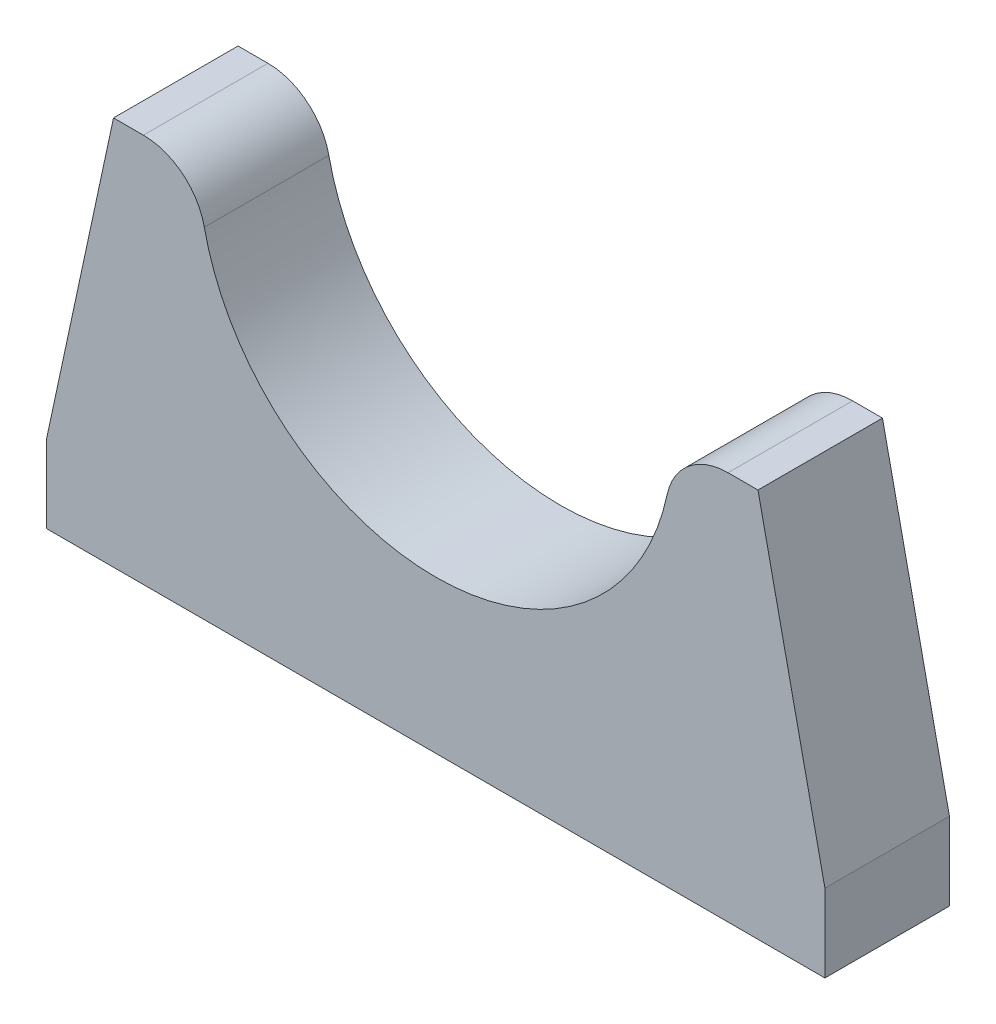
ISO-10303-21;
HEADER;
FILE_DESCRIPTION(('STEP AP214'),'2;1');
FILE_NAME('part.step','',(''),(''),'','','');
FILE_SCHEMA(('AUTOMOTIVE_DESIGN { 1 0 10303 214 1 1 1 1 }'));
ENDSEC;
DATA;
#1=APPLICATION_CONTEXT('core data for automotive mechanical design processes');
#2=APPLICATION_PROTOCOL_DEFINITION('international standard','automotive_design',2000,#1);
#3=PRODUCT_CONTEXT('',#1,'mechanical');
#4=PRODUCT('Part','Part','',(#3));
#5=PRODUCT_RELATED_PRODUCT_CATEGORY('part','',(#4));
#6=PRODUCT_DEFINITION_FORMATION('','',#4);
#7=PRODUCT_DEFINITION_CONTEXT('part definition',#1,'design');
#8=PRODUCT_DEFINITION('design','',#6,#7);
#9=PRODUCT_DEFINITION_SHAPE('','',#8);
#10=(LENGTH_UNIT() NAMED_UNIT(*) SI_UNIT(.MILLI.,.METRE.));
#11=(NAMED_UNIT(*) PLANE_ANGLE_UNIT() SI_UNIT($,.RADIAN.));
#12=(NAMED_UNIT(*) SI_UNIT($,.STERADIAN.) SOLID_ANGLE_UNIT());
#13=UNCERTAINTY_MEASURE_WITH_UNIT(LENGTH_MEASURE(1.E-05),#10,'distance_accuracy_value','');
#14=(GEOMETRIC_REPRESENTATION_CONTEXT(3) GLOBAL_UNCERTAINTY_ASSIGNED_CONTEXT((#13)) GLOBAL_UNIT_ASSIGNED_CONTEXT((#10,
#11,#12)) REPRESENTATION_CONTEXT('',''));
#15=CARTESIAN_POINT('',(0.,0.,0.));
#16=DIRECTION('',(0.,0.,1.));
#17=DIRECTION('',(1.,0.,0.));
#18=AXIS2_PLACEMENT_3D('',#15,#16,#17);
#19=CARTESIAN_POINT('',(25.,25.,8.));
#20=DIRECTION('',(0.,0.,-1.));
#21=DIRECTION('',(-1.,0.,0.));
#22=AXIS2_PLACEMENT_3D('',#19,#20,#21);
#23=CYLINDRICAL_SURFACE('',#22,15.2);
#24=CARTESIAN_POINT('',(25.,25.,8.));
#25=DIRECTION('',(0.,0.,-1.));
#26=DIRECTION('',(1.,0.,0.));
#27=AXIS2_PLACEMENT_3D('',#24,#25,#26);
#28=CIRCLE('',#27,15.2);
#29=CARTESIAN_POINT('',(39.8664798194536,21.8333333333333,8.));
#30=VERTEX_POINT('',#29);
#31=CARTESIAN_POINT('',(10.1335201805464,21.8333333333333,8.));
#32=VERTEX_POINT('',#31);
#33=EDGE_CURVE('E120',#30,#32,#28,.T.);
#34=ORIENTED_EDGE('',*,*,#33,.F.);
#35=DIRECTION('',(0.,0.,-1.));
#36=VECTOR('',#35,1.);
#37=CARTESIAN_POINT('',(39.8664798194536,21.8333333333333,8.));
#38=LINE('',#37,#36);
#39=CARTESIAN_POINT('',(39.8664798194536,21.8333333333333,0.));
#40=VERTEX_POINT('',#39);
#41=EDGE_CURVE('E179',#30,#40,#38,.T.);
#42=ORIENTED_EDGE('',*,*,#41,.T.);
#43=CARTESIAN_POINT('',(25.,25.,0.));
#44=DIRECTION('',(0.,0.,-1.));
#45=DIRECTION('',(1.,0.,0.));
#46=AXIS2_PLACEMENT_3D('',#43,#44,#45);
#47=CIRCLE('',#46,15.2);
#48=CARTESIAN_POINT('',(10.1335201805464,21.8333333333333,0.));
#49=VERTEX_POINT('',#48);
#50=EDGE_CURVE('E149',#40,#49,#47,.T.);
#51=ORIENTED_EDGE('',*,*,#50,.T.);
#52=DIRECTION('',(0.,0.,-1.));
#53=VECTOR('',#52,1.);
#54=CARTESIAN_POINT('',(10.1335201805464,21.8333333333333,8.));
#55=LINE('',#54,#53);
#56=EDGE_CURVE('E129',#49,#32,#55,.F.);
#57=ORIENTED_EDGE('',*,*,#56,.T.);
#58=EDGE_LOOP('',(#34,#42,#51,#57));
#59=FACE_BOUND('',#58,.T.);
#60=ADVANCED_FACE('F35',(#59),#23,.F.);
#61=CARTESIAN_POINT('',(9.8,25.,8.));
#62=DIRECTION('',(0.,-1.,0.));
#63=DIRECTION('',(0.,0.,-1.));
#64=AXIS2_PLACEMENT_3D('',#61,#62,#63);
#65=PLANE('',#64);
#66=DIRECTION('',(-1.,0.,0.));
#67=VECTOR('',#66,1.);
#68=CARTESIAN_POINT('',(9.8,25.,8.));
#69=LINE('',#68,#67);
#70=CARTESIAN_POINT('',(6.2212886491112,25.,8.));
#71=VERTEX_POINT('',#70);
#72=CARTESIAN_POINT('',(4.30000000000001,25.,8.));
#73=VERTEX_POINT('',#72);
#74=EDGE_CURVE('E112',#71,#73,#69,.T.);
#75=ORIENTED_EDGE('',*,*,#74,.F.);
#76=DIRECTION('',(0.,0.,-1.));
#77=VECTOR('',#76,1.);
#78=CARTESIAN_POINT('',(6.2212886491112,25.,8.));
#79=LINE('',#78,#77);
#80=CARTESIAN_POINT('',(6.2212886491112,25.,0.));
#81=VERTEX_POINT('',#80);
#82=EDGE_CURVE('E11',#71,#81,#79,.T.);
#83=ORIENTED_EDGE('',*,*,#82,.T.);
#84=DIRECTION('',(-1.,0.,0.));
#85=VECTOR('',#84,1.);
#86=CARTESIAN_POINT('',(9.8,25.,0.));
#87=LINE('',#86,#85);
#88=CARTESIAN_POINT('',(4.30000000000001,25.,0.));
#89=VERTEX_POINT('',#88);
#90=EDGE_CURVE('E126',#81,#89,#87,.T.);
#91=ORIENTED_EDGE('',*,*,#90,.T.);
#92=DIRECTION('',(0.,0.,-1.));
#93=VECTOR('',#92,1.);
#94=CARTESIAN_POINT('',(4.30000000000001,25.,8.));
#95=LINE('',#94,#93);
#96=EDGE_CURVE('E123',#73,#89,#95,.T.);
#97=ORIENTED_EDGE('',*,*,#96,.F.);
#98=EDGE_LOOP('',(#75,#83,#91,#97));
#99=FACE_BOUND('',#98,.T.);
#100=ADVANCED_FACE('F124',(#99),#65,.F.);
#101=CARTESIAN_POINT('',(4.30000000000001,25.,8.));
#102=DIRECTION('',(0.977659114060568,-0.210196709523022,0.));
#103=DIRECTION('',(0.210196709523022,0.977659114060568,0.));
#104=AXIS2_PLACEMENT_3D('',#101,#102,#103);
#105=PLANE('',#104);
#106=DIRECTION('',(-0.210196709523022,-0.977659114060568,0.));
#107=VECTOR('',#106,1.);
#108=CARTESIAN_POINT('',(4.30000000000001,25.,0.));
#109=LINE('',#108,#107);
#110=CARTESIAN_POINT('',(0.,5.,0.));
#111=VERTEX_POINT('',#110);
#112=EDGE_CURVE('E154',#89,#111,#109,.T.);
#113=ORIENTED_EDGE('',*,*,#112,.T.);
#114=DIRECTION('',(0.,0.,-1.));
#115=VECTOR('',#114,1.);
#116=CARTESIAN_POINT('',(0.,5.,8.));
#117=LINE('',#116,#115);
#118=CARTESIAN_POINT('',(0.,5.,8.));
#119=VERTEX_POINT('',#118);
#120=EDGE_CURVE('E130',#119,#111,#117,.T.);
#121=ORIENTED_EDGE('',*,*,#120,.F.);
#122=DIRECTION('',(-0.210196709523022,-0.977659114060568,0.));
#123=VECTOR('',#122,1.);
#124=CARTESIAN_POINT('',(4.30000000000001,25.,8.));
#125=LINE('',#124,#123);
#126=EDGE_CURVE('E116',#73,#119,#125,.T.);
#127=ORIENTED_EDGE('',*,*,#126,.F.);
#128=ORIENTED_EDGE('',*,*,#96,.T.);
#129=EDGE_LOOP('',(#113,#121,#127,#128));
#130=FACE_BOUND('',#129,.T.);
#131=ADVANCED_FACE('F132',(#130),#105,.F.);
#132=CARTESIAN_POINT('',(0.,5.,8.));
#133=DIRECTION('',(1.,0.,0.));
#134=DIRECTION('',(0.,1.,0.));
#135=AXIS2_PLACEMENT_3D('',#132,#133,#134);
#136=PLANE('',#135);
#137=DIRECTION('',(0.,-1.,0.));
#138=VECTOR('',#137,1.);
#139=CARTESIAN_POINT('',(0.,5.,0.));
#140=LINE('',#139,#138);
#141=CARTESIAN_POINT('',(0.,0.,0.));
#142=VERTEX_POINT('',#141);
#143=EDGE_CURVE('E156',#111,#142,#140,.T.);
#144=ORIENTED_EDGE('',*,*,#143,.T.);
#145=DIRECTION('',(0.,0.,-1.));
#146=VECTOR('',#145,1.);
#147=CARTESIAN_POINT('',(0.,0.,8.));
#148=LINE('',#147,#146);
#149=CARTESIAN_POINT('',(0.,0.,8.));
#150=VERTEX_POINT('',#149);
#151=EDGE_CURVE('E174',#150,#142,#148,.T.);
#152=ORIENTED_EDGE('',*,*,#151,.F.);
#153=DIRECTION('',(0.,-1.,0.));
#154=VECTOR('',#153,1.);
#155=CARTESIAN_POINT('',(0.,5.,8.));
#156=LINE('',#155,#154);
#157=EDGE_CURVE('E135',#119,#150,#156,.T.);
#158=ORIENTED_EDGE('',*,*,#157,.F.);
#159=ORIENTED_EDGE('',*,*,#120,.T.);
#160=EDGE_LOOP('',(#144,#152,#158,#159));
#161=FACE_BOUND('',#160,.T.);
#162=ADVANCED_FACE('F217',(#161),#136,.F.);
#163=CARTESIAN_POINT('',(0.,0.,8.));
#164=DIRECTION('',(0.,1.,0.));
#165=DIRECTION('',(0.,0.,1.));
#166=AXIS2_PLACEMENT_3D('',#163,#164,#165);
#167=PLANE('',#166);
#168=CARTESIAN_POINT('',(45.,0.,4.));
#169=DIRECTION('',(0.,-1.,0.));
#170=DIRECTION('',(0.,0.,1.));
#171=AXIS2_PLACEMENT_3D('',#168,#169,#170);
#172=CIRCLE('',#171,1.25);
#173=CARTESIAN_POINT('',(45.,0.,5.25));
#174=VERTEX_POINT('',#173);
#175=EDGE_CURVE('E268',#174,#174,#172,.T.);
#176=ORIENTED_EDGE('',*,*,#175,.F.);
#177=EDGE_LOOP('',(#176));
#178=FACE_BOUND('',#177,.T.);
#179=CARTESIAN_POINT('',(4.99999999999999,0.,4.));
#180=DIRECTION('',(0.,-1.,0.));
#181=DIRECTION('',(0.,0.,-1.));
#182=AXIS2_PLACEMENT_3D('',#179,#180,#181);
#183=CIRCLE('',#182,1.25);
#184=CARTESIAN_POINT('',(4.99999999999999,0.,2.75));
#185=VERTEX_POINT('',#184);
#186=EDGE_CURVE('E267',#185,#185,#183,.T.);
#187=ORIENTED_EDGE('',*,*,#186,.F.);
#188=EDGE_LOOP('',(#187));
#189=FACE_BOUND('',#188,.T.);
#190=DIRECTION('',(1.,0.,0.));
#191=VECTOR('',#190,1.);
#192=CARTESIAN_POINT('',(0.,0.,0.));
#193=LINE('',#192,#191);
#194=CARTESIAN_POINT('',(50.,0.,0.));
#195=VERTEX_POINT('',#194);
#196=EDGE_CURVE('E158',#142,#195,#193,.T.);
#197=ORIENTED_EDGE('',*,*,#196,.T.);
#198=DIRECTION('',(0.,0.,-1.));
#199=VECTOR('',#198,1.);
#200=CARTESIAN_POINT('',(50.,0.,8.));
#201=LINE('',#200,#199);
#202=CARTESIAN_POINT('',(50.,0.,8.));
#203=VERTEX_POINT('',#202);
#204=EDGE_CURVE('E171',#203,#195,#201,.T.);
#205=ORIENTED_EDGE('',*,*,#204,.F.);
#206=DIRECTION('',(1.,0.,0.));
#207=VECTOR('',#206,1.);
#208=CARTESIAN_POINT('',(0.,0.,8.));
#209=LINE('',#208,#207);
#210=EDGE_CURVE('E137',#150,#203,#209,.T.);
#211=ORIENTED_EDGE('',*,*,#210,.F.);
#212=ORIENTED_EDGE('',*,*,#151,.T.);
#213=EDGE_LOOP('',(#197,#205,#211,#212));
#214=FACE_BOUND('',#213,.T.);
#215=ADVANCED_FACE('F214',(#178,#189,#214),#167,.F.);
#216=CARTESIAN_POINT('',(50.,0.,8.));
#217=DIRECTION('',(-1.,0.,0.));
#218=DIRECTION('',(0.,0.,1.));
#219=AXIS2_PLACEMENT_3D('',#216,#217,#218);
#220=PLANE('',#219);
#221=DIRECTION('',(0.,1.,0.));
#222=VECTOR('',#221,1.);
#223=CARTESIAN_POINT('',(50.,0.,0.));
#224=LINE('',#223,#222);
#225=CARTESIAN_POINT('',(50.,5.,0.));
#226=VERTEX_POINT('',#225);
#227=EDGE_CURVE('E160',#195,#226,#224,.T.);
#228=ORIENTED_EDGE('',*,*,#227,.T.);
#229=DIRECTION('',(0.,0.,-1.));
#230=VECTOR('',#229,1.);
#231=CARTESIAN_POINT('',(50.,5.,8.));
#232=LINE('',#231,#230);
#233=CARTESIAN_POINT('',(50.,5.,8.));
#234=VERTEX_POINT('',#233);
#235=EDGE_CURVE('E168',#234,#226,#232,.T.);
#236=ORIENTED_EDGE('',*,*,#235,.F.);
#237=DIRECTION('',(0.,1.,0.));
#238=VECTOR('',#237,1.);
#239=CARTESIAN_POINT('',(50.,0.,8.));
#240=LINE('',#239,#238);
#241=EDGE_CURVE('E142',#203,#234,#240,.T.);
#242=ORIENTED_EDGE('',*,*,#241,.F.);
#243=ORIENTED_EDGE('',*,*,#204,.T.);
#244=EDGE_LOOP('',(#228,#236,#242,#243));
#245=FACE_BOUND('',#244,.T.);
#246=ADVANCED_FACE('F209',(#245),#220,.F.);
#247=CARTESIAN_POINT('',(50.,5.,8.));
#248=DIRECTION('',(-0.977659114060568,-0.210196709523021,0.));
#249=DIRECTION('',(0.210196709523021,-0.977659114060568,0.));
#250=AXIS2_PLACEMENT_3D('',#247,#248,#249);
#251=PLANE('',#250);
#252=DIRECTION('',(-0.210196709523021,0.977659114060568,0.));
#253=VECTOR('',#252,1.);
#254=CARTESIAN_POINT('',(50.,5.,0.));
#255=LINE('',#254,#253);
#256=CARTESIAN_POINT('',(45.7,25.,0.));
#257=VERTEX_POINT('',#256);
#258=EDGE_CURVE('E162',#226,#257,#255,.T.);
#259=ORIENTED_EDGE('',*,*,#258,.T.);
#260=DIRECTION('',(0.,0.,-1.));
#261=VECTOR('',#260,1.);
#262=CARTESIAN_POINT('',(45.7,25.,8.));
#263=LINE('',#262,#261);
#264=CARTESIAN_POINT('',(45.7,25.,8.));
#265=VERTEX_POINT('',#264);
#266=EDGE_CURVE('E148',#265,#257,#263,.T.);
#267=ORIENTED_EDGE('',*,*,#266,.F.);
#268=DIRECTION('',(-0.210196709523021,0.977659114060568,0.));
#269=VECTOR('',#268,1.);
#270=CARTESIAN_POINT('',(50.,5.,8.));
#271=LINE('',#270,#269);
#272=EDGE_CURVE('E144',#234,#265,#271,.T.);
#273=ORIENTED_EDGE('',*,*,#272,.F.);
#274=ORIENTED_EDGE('',*,*,#235,.T.);
#275=EDGE_LOOP('',(#259,#267,#273,#274));
#276=FACE_BOUND('',#275,.T.);
#277=ADVANCED_FACE('F203',(#276),#251,.F.);
#278=CARTESIAN_POINT('',(45.7,25.,8.));
#279=DIRECTION('',(0.,-1.,0.));
#280=DIRECTION('',(0.,0.,-1.));
#281=AXIS2_PLACEMENT_3D('',#278,#279,#280);
#282=PLANE('',#281);
#283=DIRECTION('',(-1.,0.,0.));
#284=VECTOR('',#283,1.);
#285=CARTESIAN_POINT('',(45.7,25.,0.));
#286=LINE('',#285,#284);
#287=CARTESIAN_POINT('',(43.7787113508888,25.,0.));
#288=VERTEX_POINT('',#287);
#289=EDGE_CURVE('E164',#257,#288,#286,.T.);
#290=ORIENTED_EDGE('',*,*,#289,.T.);
#291=DIRECTION('',(0.,0.,-1.));
#292=VECTOR('',#291,1.);
#293=CARTESIAN_POINT('',(43.7787113508888,25.,8.));
#294=LINE('',#293,#292);
#295=CARTESIAN_POINT('',(43.7787113508888,25.,8.));
#296=VERTEX_POINT('',#295);
#297=EDGE_CURVE('E58',#288,#296,#294,.F.);
#298=ORIENTED_EDGE('',*,*,#297,.T.);
#299=DIRECTION('',(-1.,0.,0.));
#300=VECTOR('',#299,1.);
#301=CARTESIAN_POINT('',(45.7,25.,8.));
#302=LINE('',#301,#300);
#303=EDGE_CURVE('E146',#265,#296,#302,.T.);
#304=ORIENTED_EDGE('',*,*,#303,.F.);
#305=ORIENTED_EDGE('',*,*,#266,.T.);
#306=EDGE_LOOP('',(#290,#298,#304,#305));
#307=FACE_BOUND('',#306,.T.);
#308=ADVANCED_FACE('F199',(#307),#282,.F.);
#309=CARTESIAN_POINT('',(25.,25.,8.));
#310=DIRECTION('',(0.,0.,1.));
#311=DIRECTION('',(1.,0.,0.));
#312=AXIS2_PLACEMENT_3D('',#309,#310,#311);
#313=PLANE('',#312);
#314=ORIENTED_EDGE('',*,*,#303,.T.);
#315=CARTESIAN_POINT('',(43.7787113508888,21.,8.));
#316=DIRECTION('',(0.,0.,1.));
#317=DIRECTION('',(1.,0.,0.));
#318=AXIS2_PLACEMENT_3D('',#315,#316,#317);
#319=CIRCLE('',#318,4.);
#320=EDGE_CURVE('E43',#296,#30,#319,.T.);
#321=ORIENTED_EDGE('',*,*,#320,.T.);
#322=ORIENTED_EDGE('',*,*,#33,.T.);
#323=CARTESIAN_POINT('',(6.2212886491112,21.,8.));
#324=DIRECTION('',(0.,0.,1.));
#325=DIRECTION('',(1.,0.,0.));
#326=AXIS2_PLACEMENT_3D('',#323,#324,#325);
#327=CIRCLE('',#326,4.);
#328=EDGE_CURVE('E50',#32,#71,#327,.T.);
#329=ORIENTED_EDGE('',*,*,#328,.T.);
#330=ORIENTED_EDGE('',*,*,#74,.T.);
#331=ORIENTED_EDGE('',*,*,#126,.T.);
#332=ORIENTED_EDGE('',*,*,#157,.T.);
#333=ORIENTED_EDGE('',*,*,#210,.T.);
#334=ORIENTED_EDGE('',*,*,#241,.T.);
#335=ORIENTED_EDGE('',*,*,#272,.T.);
#336=EDGE_LOOP('',(#314,#321,#322,#329,#330,#331,#332,#333,#334,#335));
#337=FACE_BOUND('',#336,.T.);
#338=ADVANCED_FACE('F114',(#337),#313,.T.);
#339=CARTESIAN_POINT('',(25.,25.,0.));
#340=DIRECTION('',(0.,0.,1.));
#341=DIRECTION('',(1.,0.,0.));
#342=AXIS2_PLACEMENT_3D('',#339,#340,#341);
#343=PLANE('',#342);
#344=ORIENTED_EDGE('',*,*,#50,.F.);
#345=CARTESIAN_POINT('',(43.7787113508888,21.,0.));
#346=DIRECTION('',(0.,0.,1.));
#347=DIRECTION('',(1.,0.,0.));
#348=AXIS2_PLACEMENT_3D('',#345,#346,#347);
#349=CIRCLE('',#348,4.);
#350=EDGE_CURVE('E184',#40,#288,#349,.F.);
#351=ORIENTED_EDGE('',*,*,#350,.T.);
#352=ORIENTED_EDGE('',*,*,#289,.F.);
#353=ORIENTED_EDGE('',*,*,#258,.F.);
#354=ORIENTED_EDGE('',*,*,#227,.F.);
#355=ORIENTED_EDGE('',*,*,#196,.F.);
#356=ORIENTED_EDGE('',*,*,#143,.F.);
#357=ORIENTED_EDGE('',*,*,#112,.F.);
#358=ORIENTED_EDGE('',*,*,#90,.F.);
#359=CARTESIAN_POINT('',(6.2212886491112,21.,0.));
#360=DIRECTION('',(0.,0.,1.));
#361=DIRECTION('',(1.,0.,0.));
#362=AXIS2_PLACEMENT_3D('',#359,#360,#361);
#363=CIRCLE('',#362,4.);
#364=EDGE_CURVE('E182',#81,#49,#363,.F.);
#365=ORIENTED_EDGE('',*,*,#364,.T.);
#366=EDGE_LOOP('',(#344,#351,#352,#353,#354,#355,#356,#357,#358,#365));
#367=FACE_BOUND('',#366,.T.);
#368=ADVANCED_FACE('F197',(#367),#343,.F.);
#369=CARTESIAN_POINT('',(43.7787113508888,21.,8.));
#370=DIRECTION('',(0.,0.,-1.));
#371=DIRECTION('',(-1.,0.,0.));
#372=AXIS2_PLACEMENT_3D('',#369,#370,#371);
#373=CYLINDRICAL_SURFACE('',#372,4.);
#374=ORIENTED_EDGE('',*,*,#320,.F.);
#375=ORIENTED_EDGE('',*,*,#297,.F.);
#376=ORIENTED_EDGE('',*,*,#350,.F.);
#377=ORIENTED_EDGE('',*,*,#41,.F.);
#378=EDGE_LOOP('',(#374,#375,#376,#377));
#379=FACE_BOUND('',#378,.T.);
#380=ADVANCED_FACE('F194',(#379),#373,.T.);
#381=CARTESIAN_POINT('',(6.2212886491112,21.,8.));
#382=DIRECTION('',(0.,0.,-1.));
#383=DIRECTION('',(-1.,0.,0.));
#384=AXIS2_PLACEMENT_3D('',#381,#382,#383);
#385=CYLINDRICAL_SURFACE('',#384,4.);
#386=ORIENTED_EDGE('',*,*,#328,.F.);
#387=ORIENTED_EDGE('',*,*,#56,.F.);
#388=ORIENTED_EDGE('',*,*,#364,.F.);
#389=ORIENTED_EDGE('',*,*,#82,.F.);
#390=EDGE_LOOP('',(#386,#387,#388,#389));
#391=FACE_BOUND('',#390,.T.);
#392=ADVANCED_FACE('F37',(#391),#385,.T.);
#393=CARTESIAN_POINT('',(4.99999999999999,8.,4.));
#394=DIRECTION('',(0.,-1.,0.));
#395=DIRECTION('',(0.,0.,-1.));
#396=AXIS2_PLACEMENT_3D('',#393,#394,#395);
#397=CYLINDRICAL_SURFACE('',#396,1.25);
#398=CARTESIAN_POINT('',(4.99999999999999,8.,4.));
#399=DIRECTION('',(0.,-1.,0.));
#400=DIRECTION('',(0.,0.,-1.));
#401=AXIS2_PLACEMENT_3D('',#398,#399,#400);
#402=CIRCLE('',#401,1.25);
#403=CARTESIAN_POINT('',(4.99999999999999,8.,2.75));
#404=VERTEX_POINT('',#403);
#405=EDGE_CURVE('E152',#404,#404,#402,.T.);
#406=ORIENTED_EDGE('',*,*,#405,.F.);
#407=EDGE_LOOP('',(#406));
#408=FACE_BOUND('',#407,.T.);
#409=ORIENTED_EDGE('',*,*,#186,.T.);
#410=EDGE_LOOP('',(#409));
#411=FACE_BOUND('',#410,.T.);
#412=ADVANCED_FACE('F220',(#408,#411),#397,.F.);
#413=CARTESIAN_POINT('',(4.99999999999999,8.,4.));
#414=DIRECTION('',(0.,-1.,0.));
#415=DIRECTION('',(0.,0.,-1.));
#416=AXIS2_PLACEMENT_3D('',#413,#414,#415);
#417=PLANE('',#416);
#418=ORIENTED_EDGE('',*,*,#405,.T.);
#419=EDGE_LOOP('',(#418));
#420=FACE_BOUND('',#419,.T.);
#421=ADVANCED_FACE('F225',(#420),#417,.T.);
#422=CARTESIAN_POINT('',(45.,8.,4.));
#423=DIRECTION('',(0.,-1.,0.));
#424=DIRECTION('',(0.,0.,-1.));
#425=AXIS2_PLACEMENT_3D('',#422,#423,#424);
#426=CYLINDRICAL_SURFACE('',#425,1.25);
#427=CARTESIAN_POINT('',(45.,8.,4.));
#428=DIRECTION('',(0.,-1.,0.));
#429=DIRECTION('',(0.,0.,1.));
#430=AXIS2_PLACEMENT_3D('',#427,#428,#429);
#431=CIRCLE('',#430,1.25);
#432=CARTESIAN_POINT('',(45.,8.,5.25));
#433=VERTEX_POINT('',#432);
#434=EDGE_CURVE('E266',#433,#433,#431,.T.);
#435=ORIENTED_EDGE('',*,*,#434,.F.);
#436=EDGE_LOOP('',(#435));
#437=FACE_BOUND('',#436,.T.);
#438=ORIENTED_EDGE('',*,*,#175,.T.);
#439=EDGE_LOOP('',(#438));
#440=FACE_BOUND('',#439,.T.);
#441=ADVANCED_FACE('F254',(#437,#440),#426,.F.);
#442=CARTESIAN_POINT('',(45.,8.,4.));
#443=DIRECTION('',(0.,1.,0.));
#444=DIRECTION('',(0.,0.,1.));
#445=AXIS2_PLACEMENT_3D('',#442,#443,#444);
#446=PLANE('',#445);
#447=ORIENTED_EDGE('',*,*,#434,.T.);
#448=EDGE_LOOP('',(#447));
#449=FACE_BOUND('',#448,.T.);
#450=ADVANCED_FACE('F258',(#449),#446,.F.);
#451=CLOSED_SHELL('',(#60,#100,#131,#162,#215,#246,#277,#308,#338,#368,#380,#392,#412,#421,#441,#450));
#452=MANIFOLD_SOLID_BREP('B2',#451);
#453=ADVANCED_BREP_SHAPE_REPRESENTATION('',(#18,#452),#14);
#454=SHAPE_DEFINITION_REPRESENTATION(#9,#453);
ENDSEC;
END-ISO-10303-21;
